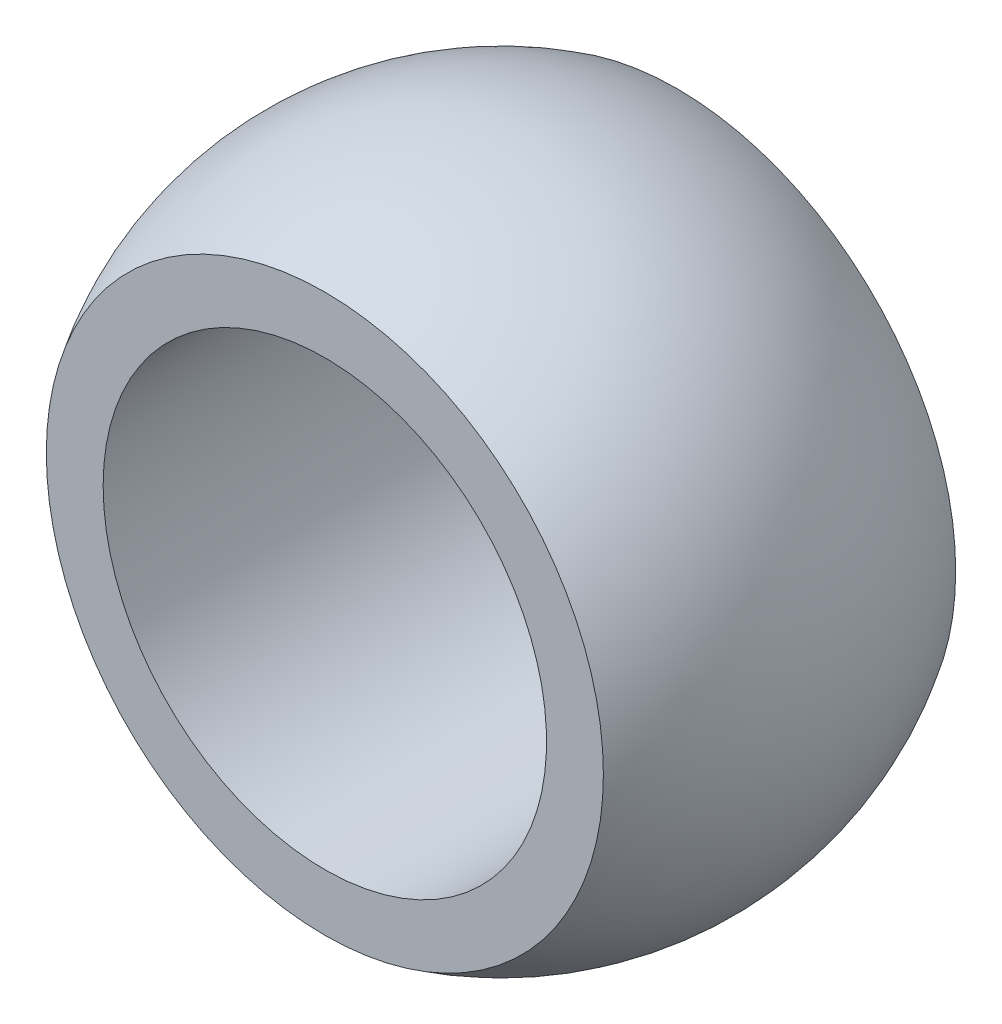
ISO-10303-21;
HEADER;
FILE_DESCRIPTION(('STEP AP214'),'2;1');
FILE_NAME('part.step','',(''),(''),'','','');
FILE_SCHEMA(('AUTOMOTIVE_DESIGN { 1 0 10303 214 1 1 1 1 }'));
ENDSEC;
DATA;
#1=APPLICATION_CONTEXT('core data for automotive mechanical design processes');
#2=APPLICATION_PROTOCOL_DEFINITION('international standard','automotive_design',2000,#1);
#3=PRODUCT_CONTEXT('',#1,'mechanical');
#4=PRODUCT('Part','Part','',(#3));
#5=PRODUCT_RELATED_PRODUCT_CATEGORY('part','',(#4));
#6=PRODUCT_DEFINITION_FORMATION('','',#4);
#7=PRODUCT_DEFINITION_CONTEXT('part definition',#1,'design');
#8=PRODUCT_DEFINITION('design','',#6,#7);
#9=PRODUCT_DEFINITION_SHAPE('','',#8);
#10=(LENGTH_UNIT() NAMED_UNIT(*) SI_UNIT(.MILLI.,.METRE.));
#11=(NAMED_UNIT(*) PLANE_ANGLE_UNIT() SI_UNIT($,.RADIAN.));
#12=(NAMED_UNIT(*) SI_UNIT($,.STERADIAN.) SOLID_ANGLE_UNIT());
#13=UNCERTAINTY_MEASURE_WITH_UNIT(LENGTH_MEASURE(1.E-05),#10,'distance_accuracy_value','');
#14=(GEOMETRIC_REPRESENTATION_CONTEXT(3) GLOBAL_UNCERTAINTY_ASSIGNED_CONTEXT((#13)) GLOBAL_UNIT_ASSIGNED_CONTEXT((#10,
#11,#12)) REPRESENTATION_CONTEXT('',''));
#15=CARTESIAN_POINT('',(0.,0.,0.));
#16=DIRECTION('',(0.,0.,1.));
#17=DIRECTION('',(1.,0.,0.));
#18=AXIS2_PLACEMENT_3D('',#15,#16,#17);
#19=CARTESIAN_POINT('',(0.,0.,0.));
#20=DIRECTION('',(0.,-1.,0.));
#21=DIRECTION('',(-1.,0.,0.));
#22=AXIS2_PLACEMENT_3D('',#19,#20,#21);
#23=SPHERICAL_SURFACE('',#22,29.);
#24=CARTESIAN_POINT('',(0.,0.,0.));
#25=DIRECTION('',(0.,0.,-1.));
#26=DIRECTION('',(-1.,0.,0.));
#27=AXIS2_PLACEMENT_3D('',#24,#25,#26);
#28=SPHERICAL_SURFACE('',#27,29.);
#29=CARTESIAN_POINT('',(0.,0.,15.5));
#30=DIRECTION('',(0.,0.,-1.));
#31=DIRECTION('',(-1.,0.,0.));
#32=AXIS2_PLACEMENT_3D('',#29,#30,#31);
#33=CIRCLE('',#32,24.5102019575523);
#34=CARTESIAN_POINT('',(-24.5102019575523,0.,15.5));
#35=VERTEX_POINT('',#34);
#36=EDGE_CURVE('E35',#35,#35,#33,.F.);
#37=ORIENTED_EDGE('',*,*,#36,.F.);
#38=EDGE_LOOP('',(#37));
#39=FACE_BOUND('',#38,.T.);
#40=CARTESIAN_POINT('',(0.,0.,-15.5));
#41=DIRECTION('',(0.,0.,1.));
#42=DIRECTION('',(1.,0.,0.));
#43=AXIS2_PLACEMENT_3D('',#40,#41,#42);
#44=CIRCLE('',#43,24.5102019575523);
#45=CARTESIAN_POINT('',(24.5102019575523,0.,-15.5));
#46=VERTEX_POINT('',#45);
#47=EDGE_CURVE('E10',#46,#46,#44,.F.);
#48=ORIENTED_EDGE('',*,*,#47,.F.);
#49=EDGE_LOOP('',(#48));
#50=FACE_BOUND('',#49,.T.);
#51=ADVANCED_FACE('F32',(#39,#50),#28,.T.);
#52=CARTESIAN_POINT('',(0.,0.,-15.5));
#53=DIRECTION('',(0.,0.,1.));
#54=DIRECTION('',(1.,0.,0.));
#55=AXIS2_PLACEMENT_3D('',#52,#53,#54);
#56=PLANE('',#55);
#57=CARTESIAN_POINT('',(0.,0.,-15.5));
#58=DIRECTION('',(0.,0.,-1.));
#59=DIRECTION('',(-1.,0.,0.));
#60=AXIS2_PLACEMENT_3D('',#57,#58,#59);
#61=CIRCLE('',#60,19.5102019575523);
#62=CARTESIAN_POINT('',(-19.5102019575523,0.,-15.5));
#63=VERTEX_POINT('',#62);
#64=EDGE_CURVE('E44',#63,#63,#61,.T.);
#65=ORIENTED_EDGE('',*,*,#64,.F.);
#66=EDGE_LOOP('',(#65));
#67=FACE_BOUND('',#66,.T.);
#68=ORIENTED_EDGE('',*,*,#47,.T.);
#69=EDGE_LOOP('',(#68));
#70=FACE_BOUND('',#69,.T.);
#71=ADVANCED_FACE('F59',(#67,#70),#56,.F.);
#72=CARTESIAN_POINT('',(0.,0.,15.5));
#73=DIRECTION('',(0.,0.,-1.));
#74=DIRECTION('',(1.,0.,0.));
#75=AXIS2_PLACEMENT_3D('',#72,#73,#74);
#76=PLANE('',#75);
#77=CARTESIAN_POINT('',(0.,0.,15.5));
#78=DIRECTION('',(0.,0.,-1.));
#79=DIRECTION('',(-1.,0.,0.));
#80=AXIS2_PLACEMENT_3D('',#77,#78,#79);
#81=CIRCLE('',#80,19.5102019575523);
#82=CARTESIAN_POINT('',(-19.5102019575523,0.,15.5));
#83=VERTEX_POINT('',#82);
#84=EDGE_CURVE('E42',#83,#83,#81,.T.);
#85=ORIENTED_EDGE('',*,*,#84,.T.);
#86=EDGE_LOOP('',(#85));
#87=FACE_BOUND('',#86,.T.);
#88=ORIENTED_EDGE('',*,*,#36,.T.);
#89=EDGE_LOOP('',(#88));
#90=FACE_BOUND('',#89,.T.);
#91=ADVANCED_FACE('F50',(#87,#90),#76,.F.);
#92=CARTESIAN_POINT('',(0.,0.,15.5));
#93=DIRECTION('',(0.,0.,-1.));
#94=DIRECTION('',(-1.,0.,0.));
#95=AXIS2_PLACEMENT_3D('',#92,#93,#94);
#96=CYLINDRICAL_SURFACE('',#95,19.5102019575523);
#97=ORIENTED_EDGE('',*,*,#84,.F.);
#98=EDGE_LOOP('',(#97));
#99=FACE_BOUND('',#98,.T.);
#100=ORIENTED_EDGE('',*,*,#64,.T.);
#101=EDGE_LOOP('',(#100));
#102=FACE_BOUND('',#101,.T.);
#103=ADVANCED_FACE('F53',(#99,#102),#96,.F.);
#104=CLOSED_SHELL('',(#51,#71,#91,#103));
#105=MANIFOLD_SOLID_BREP('B2',#104);
#106=ADVANCED_BREP_SHAPE_REPRESENTATION('',(#18,#105),#14);
#107=SHAPE_DEFINITION_REPRESENTATION(#9,#106);
ENDSEC;
END-ISO-10303-21;
